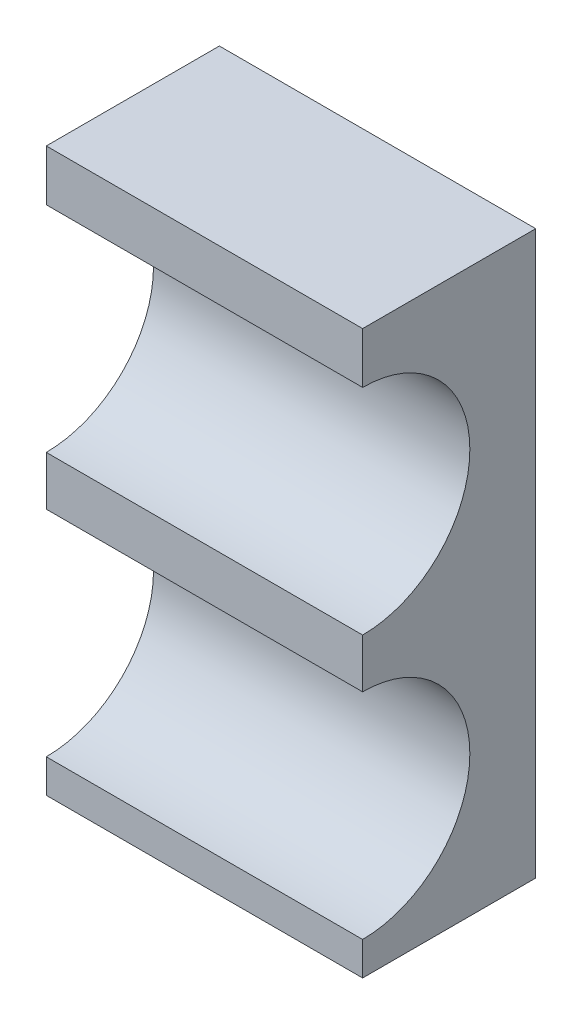
ISO-10303-21;
HEADER;
FILE_DESCRIPTION(('STEP AP214'),'2;1');
FILE_NAME('part.step','',(''),(''),'','','');
FILE_SCHEMA(('AUTOMOTIVE_DESIGN { 1 0 10303 214 1 1 1 1 }'));
ENDSEC;
DATA;
#1=APPLICATION_CONTEXT('core data for automotive mechanical design processes');
#2=APPLICATION_PROTOCOL_DEFINITION('international standard','automotive_design',2000,#1);
#3=PRODUCT_CONTEXT('',#1,'mechanical');
#4=PRODUCT('Part','Part','',(#3));
#5=PRODUCT_RELATED_PRODUCT_CATEGORY('part','',(#4));
#6=PRODUCT_DEFINITION_FORMATION('','',#4);
#7=PRODUCT_DEFINITION_CONTEXT('part definition',#1,'design');
#8=PRODUCT_DEFINITION('design','',#6,#7);
#9=PRODUCT_DEFINITION_SHAPE('','',#8);
#10=(LENGTH_UNIT() NAMED_UNIT(*) SI_UNIT(.MILLI.,.METRE.));
#11=(NAMED_UNIT(*) PLANE_ANGLE_UNIT() SI_UNIT($,.RADIAN.));
#12=(NAMED_UNIT(*) SI_UNIT($,.STERADIAN.) SOLID_ANGLE_UNIT());
#13=UNCERTAINTY_MEASURE_WITH_UNIT(LENGTH_MEASURE(1.E-05),#10,'distance_accuracy_value','');
#14=(GEOMETRIC_REPRESENTATION_CONTEXT(3) GLOBAL_UNCERTAINTY_ASSIGNED_CONTEXT((#13)) GLOBAL_UNIT_ASSIGNED_CONTEXT((#10,
#11,#12)) REPRESENTATION_CONTEXT('',''));
#15=CARTESIAN_POINT('',(0.,0.,0.));
#16=DIRECTION('',(0.,0.,1.));
#17=DIRECTION('',(1.,0.,0.));
#18=AXIS2_PLACEMENT_3D('',#15,#16,#17);
#19=CARTESIAN_POINT('',(9.,-8.,-4.92401215805471));
#20=DIRECTION('',(0.,-1.,0.));
#21=DIRECTION('',(0.,0.,-1.));
#22=AXIS2_PLACEMENT_3D('',#19,#20,#21);
#23=PLANE('',#22);
#24=DIRECTION('',(1.,0.,0.));
#25=VECTOR('',#24,1.);
#26=CARTESIAN_POINT('',(9.,-8.,0.));
#27=LINE('',#26,#25);
#28=CARTESIAN_POINT('',(0.,-7.99999999999999,0.));
#29=VERTEX_POINT('',#28);
#30=CARTESIAN_POINT('',(9.,-7.99999999999999,0.));
#31=VERTEX_POINT('',#30);
#32=EDGE_CURVE('E106',#29,#31,#27,.T.);
#33=ORIENTED_EDGE('',*,*,#32,.F.);
#34=DIRECTION('',(0.,0.,1.));
#35=VECTOR('',#34,1.);
#36=CARTESIAN_POINT('',(0.,-8.,-4.92401215805471));
#37=LINE('',#36,#35);
#38=CARTESIAN_POINT('',(0.,-8.,-4.92401215805471));
#39=VERTEX_POINT('',#38);
#40=EDGE_CURVE('E126',#39,#29,#37,.T.);
#41=ORIENTED_EDGE('',*,*,#40,.F.);
#42=DIRECTION('',(-1.,0.,0.));
#43=VECTOR('',#42,1.);
#44=CARTESIAN_POINT('',(9.,-8.,-4.92401215805471));
#45=LINE('',#44,#43);
#46=CARTESIAN_POINT('',(9.,-8.,-4.92401215805471));
#47=VERTEX_POINT('',#46);
#48=EDGE_CURVE('E135',#47,#39,#45,.T.);
#49=ORIENTED_EDGE('',*,*,#48,.F.);
#50=DIRECTION('',(0.,0.,1.));
#51=VECTOR('',#50,1.);
#52=CARTESIAN_POINT('',(9.,-8.,-4.92401215805471));
#53=LINE('',#52,#51);
#54=EDGE_CURVE('E128',#47,#31,#53,.T.);
#55=ORIENTED_EDGE('',*,*,#54,.T.);
#56=EDGE_LOOP('',(#33,#41,#49,#55));
#57=FACE_BOUND('',#56,.T.);
#58=ADVANCED_FACE('F36',(#57),#23,.T.);
#59=CARTESIAN_POINT('',(9.,-8.,-4.92401215805471));
#60=DIRECTION('',(0.,0.,1.));
#61=DIRECTION('',(1.,0.,0.));
#62=AXIS2_PLACEMENT_3D('',#59,#60,#61);
#63=PLANE('',#62);
#64=DIRECTION('',(0.,1.,0.));
#65=VECTOR('',#64,1.);
#66=CARTESIAN_POINT('',(0.,-8.,-4.92401215805471));
#67=LINE('',#66,#65);
#68=CARTESIAN_POINT('',(0.,8.,-4.92401215805471));
#69=VERTEX_POINT('',#68);
#70=EDGE_CURVE('E125',#39,#69,#67,.T.);
#71=ORIENTED_EDGE('',*,*,#70,.T.);
#72=DIRECTION('',(-1.,0.,0.));
#73=VECTOR('',#72,1.);
#74=CARTESIAN_POINT('',(9.,8.,-4.92401215805471));
#75=LINE('',#74,#73);
#76=CARTESIAN_POINT('',(9.,8.,-4.92401215805471));
#77=VERTEX_POINT('',#76);
#78=EDGE_CURVE('E124',#77,#69,#75,.T.);
#79=ORIENTED_EDGE('',*,*,#78,.F.);
#80=DIRECTION('',(0.,1.,0.));
#81=VECTOR('',#80,1.);
#82=CARTESIAN_POINT('',(9.,-8.,-4.92401215805471));
#83=LINE('',#82,#81);
#84=EDGE_CURVE('E137',#47,#77,#83,.T.);
#85=ORIENTED_EDGE('',*,*,#84,.F.);
#86=ORIENTED_EDGE('',*,*,#48,.T.);
#87=EDGE_LOOP('',(#71,#79,#85,#86));
#88=FACE_BOUND('',#87,.T.);
#89=ADVANCED_FACE('F166',(#88),#63,.F.);
#90=CARTESIAN_POINT('',(9.,8.,-4.92401215805471));
#91=DIRECTION('',(0.,-1.,0.));
#92=DIRECTION('',(0.,0.,-1.));
#93=AXIS2_PLACEMENT_3D('',#90,#91,#92);
#94=PLANE('',#93);
#95=DIRECTION('',(0.,0.,1.));
#96=VECTOR('',#95,1.);
#97=CARTESIAN_POINT('',(0.,8.,-4.92401215805471));
#98=LINE('',#97,#96);
#99=CARTESIAN_POINT('',(0.,8.,0.));
#100=VERTEX_POINT('',#99);
#101=EDGE_CURVE('E114',#69,#100,#98,.T.);
#102=ORIENTED_EDGE('',*,*,#101,.T.);
#103=DIRECTION('',(1.,0.,0.));
#104=VECTOR('',#103,1.);
#105=CARTESIAN_POINT('',(9.,8.,0.));
#106=LINE('',#105,#104);
#107=CARTESIAN_POINT('',(9.,8.,0.));
#108=VERTEX_POINT('',#107);
#109=EDGE_CURVE('E98',#100,#108,#106,.T.);
#110=ORIENTED_EDGE('',*,*,#109,.T.);
#111=DIRECTION('',(0.,0.,1.));
#112=VECTOR('',#111,1.);
#113=CARTESIAN_POINT('',(9.,8.,-4.92401215805471));
#114=LINE('',#113,#112);
#115=EDGE_CURVE('E145',#77,#108,#114,.T.);
#116=ORIENTED_EDGE('',*,*,#115,.F.);
#117=ORIENTED_EDGE('',*,*,#78,.T.);
#118=EDGE_LOOP('',(#102,#110,#116,#117));
#119=FACE_BOUND('',#118,.T.);
#120=ADVANCED_FACE('F122',(#119),#94,.F.);
#121=CARTESIAN_POINT('',(9.,0.,0.));
#122=DIRECTION('',(-1.,0.,0.));
#123=DIRECTION('',(0.,0.,1.));
#124=AXIS2_PLACEMENT_3D('',#121,#122,#123);
#125=PLANE('',#124);
#126=ORIENTED_EDGE('',*,*,#115,.T.);
#127=DIRECTION('',(0.,-1.,0.));
#128=VECTOR('',#127,1.);
#129=CARTESIAN_POINT('',(9.,10.0769673964862,0.));
#130=LINE('',#129,#128);
#131=CARTESIAN_POINT('',(9.,6.55,0.));
#132=VERTEX_POINT('',#131);
#133=EDGE_CURVE('E101',#108,#132,#130,.T.);
#134=ORIENTED_EDGE('',*,*,#133,.T.);
#135=CARTESIAN_POINT('',(9.,3.5,0.));
#136=DIRECTION('',(-1.,0.,0.));
#137=DIRECTION('',(0.,0.,1.));
#138=AXIS2_PLACEMENT_3D('',#135,#136,#137);
#139=CIRCLE('',#138,3.05);
#140=CARTESIAN_POINT('',(9.,0.450000000000002,0.));
#141=VERTEX_POINT('',#140);
#142=EDGE_CURVE('E131',#132,#141,#139,.T.);
#143=ORIENTED_EDGE('',*,*,#142,.T.);
#144=CARTESIAN_POINT('',(9.,-0.949999999999999,0.));
#145=VERTEX_POINT('',#144);
#146=EDGE_CURVE('E147',#141,#145,#130,.T.);
#147=ORIENTED_EDGE('',*,*,#146,.T.);
#148=CARTESIAN_POINT('',(9.,-4.,0.));
#149=DIRECTION('',(-1.,0.,0.));
#150=DIRECTION('',(0.,0.,1.));
#151=AXIS2_PLACEMENT_3D('',#148,#149,#150);
#152=CIRCLE('',#151,3.05);
#153=CARTESIAN_POINT('',(9.,-7.05,0.));
#154=VERTEX_POINT('',#153);
#155=EDGE_CURVE('E155',#145,#154,#152,.T.);
#156=ORIENTED_EDGE('',*,*,#155,.T.);
#157=EDGE_CURVE('E50',#154,#31,#130,.T.);
#158=ORIENTED_EDGE('',*,*,#157,.T.);
#159=ORIENTED_EDGE('',*,*,#54,.F.);
#160=ORIENTED_EDGE('',*,*,#84,.T.);
#161=EDGE_LOOP('',(#126,#134,#143,#147,#156,#158,#159,#160));
#162=FACE_BOUND('',#161,.T.);
#163=ADVANCED_FACE('F143',(#162),#125,.F.);
#164=CARTESIAN_POINT('',(0.,0.,0.));
#165=DIRECTION('',(-1.,0.,0.));
#166=DIRECTION('',(0.,0.,1.));
#167=AXIS2_PLACEMENT_3D('',#164,#165,#166);
#168=PLANE('',#167);
#169=DIRECTION('',(0.,-1.,0.));
#170=VECTOR('',#169,1.);
#171=CARTESIAN_POINT('',(0.,10.0769673964862,0.));
#172=LINE('',#171,#170);
#173=CARTESIAN_POINT('',(0.,6.55,0.));
#174=VERTEX_POINT('',#173);
#175=EDGE_CURVE('E58',#100,#174,#172,.T.);
#176=ORIENTED_EDGE('',*,*,#175,.F.);
#177=ORIENTED_EDGE('',*,*,#101,.F.);
#178=ORIENTED_EDGE('',*,*,#70,.F.);
#179=ORIENTED_EDGE('',*,*,#40,.T.);
#180=CARTESIAN_POINT('',(0.,-7.05,0.));
#181=VERTEX_POINT('',#180);
#182=EDGE_CURVE('E120',#181,#29,#172,.T.);
#183=ORIENTED_EDGE('',*,*,#182,.F.);
#184=CARTESIAN_POINT('',(0.,-4.,0.));
#185=DIRECTION('',(-1.,0.,0.));
#186=DIRECTION('',(0.,0.,1.));
#187=AXIS2_PLACEMENT_3D('',#184,#185,#186);
#188=CIRCLE('',#187,3.05);
#189=CARTESIAN_POINT('',(0.,-0.949999999999999,0.));
#190=VERTEX_POINT('',#189);
#191=EDGE_CURVE('E163',#190,#181,#188,.T.);
#192=ORIENTED_EDGE('',*,*,#191,.F.);
#193=CARTESIAN_POINT('',(0.,0.450000000000002,0.));
#194=VERTEX_POINT('',#193);
#195=EDGE_CURVE('E118',#194,#190,#172,.T.);
#196=ORIENTED_EDGE('',*,*,#195,.F.);
#197=CARTESIAN_POINT('',(0.,3.5,0.));
#198=DIRECTION('',(-1.,0.,0.));
#199=DIRECTION('',(0.,0.,1.));
#200=AXIS2_PLACEMENT_3D('',#197,#198,#199);
#201=CIRCLE('',#200,3.05);
#202=EDGE_CURVE('E117',#174,#194,#201,.T.);
#203=ORIENTED_EDGE('',*,*,#202,.F.);
#204=EDGE_LOOP('',(#176,#177,#178,#179,#183,#192,#196,#203));
#205=FACE_BOUND('',#204,.T.);
#206=ADVANCED_FACE('F112',(#205),#168,.T.);
#207=CARTESIAN_POINT('',(9.,-4.,0.));
#208=DIRECTION('',(-1.,0.,0.));
#209=DIRECTION('',(0.,0.,1.));
#210=AXIS2_PLACEMENT_3D('',#207,#208,#209);
#211=CYLINDRICAL_SURFACE('',#210,3.05);
#212=ORIENTED_EDGE('',*,*,#191,.T.);
#213=DIRECTION('',(-1.,0.,0.));
#214=VECTOR('',#213,1.);
#215=CARTESIAN_POINT('',(9.,-7.05,0.));
#216=LINE('',#215,#214);
#217=EDGE_CURVE('E107',#181,#154,#216,.F.);
#218=ORIENTED_EDGE('',*,*,#217,.T.);
#219=ORIENTED_EDGE('',*,*,#155,.F.);
#220=DIRECTION('',(-1.,0.,0.));
#221=VECTOR('',#220,1.);
#222=CARTESIAN_POINT('',(9.,-0.949999999999999,0.));
#223=LINE('',#222,#221);
#224=EDGE_CURVE('E146',#145,#190,#223,.T.);
#225=ORIENTED_EDGE('',*,*,#224,.T.);
#226=EDGE_LOOP('',(#212,#218,#219,#225));
#227=FACE_BOUND('',#226,.T.);
#228=ADVANCED_FACE('F171',(#227),#211,.F.);
#229=CARTESIAN_POINT('',(9.,3.5,0.));
#230=DIRECTION('',(-1.,0.,0.));
#231=DIRECTION('',(0.,0.,1.));
#232=AXIS2_PLACEMENT_3D('',#229,#230,#231);
#233=CYLINDRICAL_SURFACE('',#232,3.05);
#234=ORIENTED_EDGE('',*,*,#202,.T.);
#235=DIRECTION('',(-1.,0.,0.));
#236=VECTOR('',#235,1.);
#237=CARTESIAN_POINT('',(9.,0.450000000000002,0.));
#238=LINE('',#237,#236);
#239=EDGE_CURVE('E11',#194,#141,#238,.F.);
#240=ORIENTED_EDGE('',*,*,#239,.T.);
#241=ORIENTED_EDGE('',*,*,#142,.F.);
#242=DIRECTION('',(-1.,0.,0.));
#243=VECTOR('',#242,1.);
#244=CARTESIAN_POINT('',(9.,6.55,0.));
#245=LINE('',#244,#243);
#246=EDGE_CURVE('E43',#132,#174,#245,.T.);
#247=ORIENTED_EDGE('',*,*,#246,.T.);
#248=EDGE_LOOP('',(#234,#240,#241,#247));
#249=FACE_BOUND('',#248,.T.);
#250=ADVANCED_FACE('F140',(#249),#233,.F.);
#251=CARTESIAN_POINT('',(9.,10.0769673964862,0.));
#252=DIRECTION('',(0.,0.,-1.));
#253=DIRECTION('',(0.,1.,0.));
#254=AXIS2_PLACEMENT_3D('',#251,#252,#253);
#255=PLANE('',#254);
#256=ORIENTED_EDGE('',*,*,#175,.T.);
#257=ORIENTED_EDGE('',*,*,#246,.F.);
#258=ORIENTED_EDGE('',*,*,#133,.F.);
#259=ORIENTED_EDGE('',*,*,#109,.F.);
#260=EDGE_LOOP('',(#256,#257,#258,#259));
#261=FACE_BOUND('',#260,.T.);
#262=ADVANCED_FACE('F99',(#261),#255,.F.);
#263=ORIENTED_EDGE('',*,*,#146,.F.);
#264=ORIENTED_EDGE('',*,*,#239,.F.);
#265=ORIENTED_EDGE('',*,*,#195,.T.);
#266=ORIENTED_EDGE('',*,*,#224,.F.);
#267=EDGE_LOOP('',(#263,#264,#265,#266));
#268=FACE_BOUND('',#267,.T.);
#269=ADVANCED_FACE('F178',(#268),#255,.F.);
#270=ORIENTED_EDGE('',*,*,#32,.T.);
#271=ORIENTED_EDGE('',*,*,#157,.F.);
#272=ORIENTED_EDGE('',*,*,#217,.F.);
#273=ORIENTED_EDGE('',*,*,#182,.T.);
#274=EDGE_LOOP('',(#270,#271,#272,#273));
#275=FACE_BOUND('',#274,.T.);
#276=ADVANCED_FACE('F176',(#275),#255,.F.);
#277=CLOSED_SHELL('',(#58,#89,#120,#163,#206,#228,#250,#262,#269,#276));
#278=MANIFOLD_SOLID_BREP('B2',#277);
#279=ADVANCED_BREP_SHAPE_REPRESENTATION('',(#18,#278),#14);
#280=SHAPE_DEFINITION_REPRESENTATION(#9,#279);
ENDSEC;
END-ISO-10303-21;
